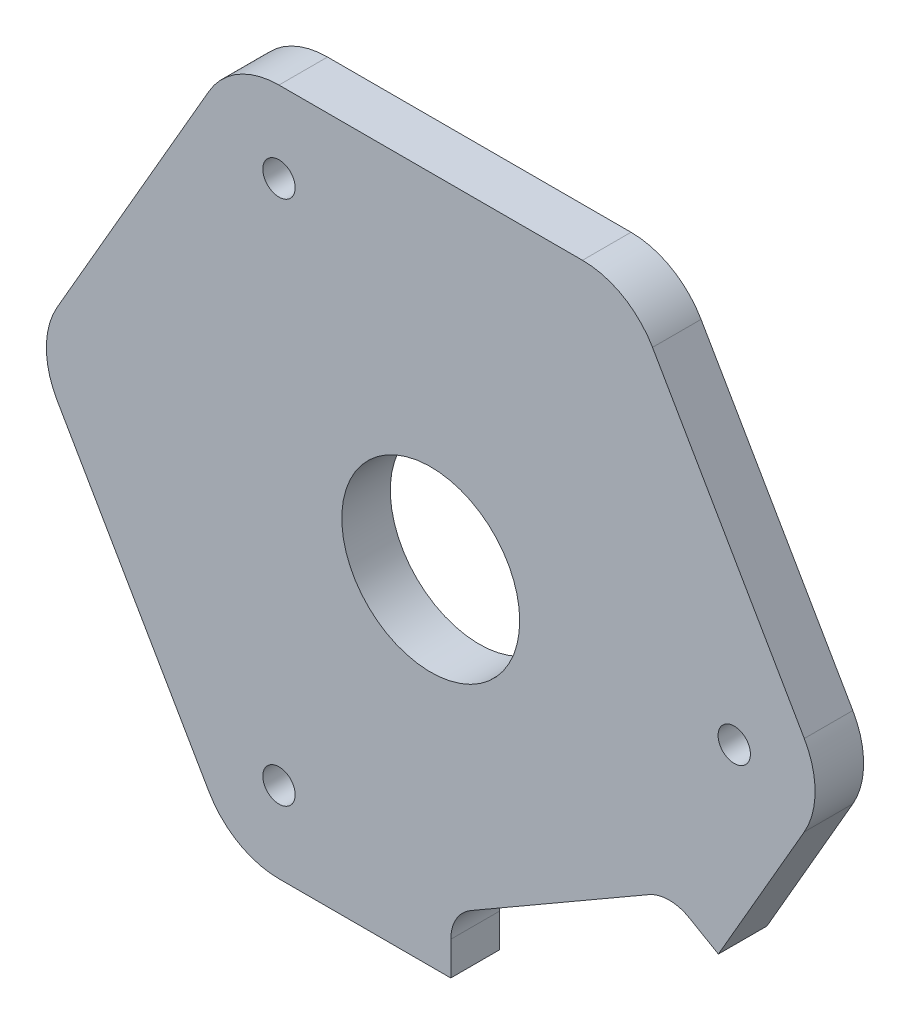
ISO-10303-21;
HEADER;
FILE_DESCRIPTION(('STEP AP214'),'2;1');
FILE_NAME('part.step','',(''),(''),'','','');
FILE_SCHEMA(('AUTOMOTIVE_DESIGN { 1 0 10303 214 1 1 1 1 }'));
ENDSEC;
DATA;
#1=APPLICATION_CONTEXT('core data for automotive mechanical design processes');
#2=APPLICATION_PROTOCOL_DEFINITION('international standard','automotive_design',2000,#1);
#3=PRODUCT_CONTEXT('',#1,'mechanical');
#4=PRODUCT('Part','Part','',(#3));
#5=PRODUCT_RELATED_PRODUCT_CATEGORY('part','',(#4));
#6=PRODUCT_DEFINITION_FORMATION('','',#4);
#7=PRODUCT_DEFINITION_CONTEXT('part definition',#1,'design');
#8=PRODUCT_DEFINITION('design','',#6,#7);
#9=PRODUCT_DEFINITION_SHAPE('','',#8);
#10=(LENGTH_UNIT() NAMED_UNIT(*) SI_UNIT(.MILLI.,.METRE.));
#11=(NAMED_UNIT(*) PLANE_ANGLE_UNIT() SI_UNIT($,.RADIAN.));
#12=(NAMED_UNIT(*) SI_UNIT($,.STERADIAN.) SOLID_ANGLE_UNIT());
#13=UNCERTAINTY_MEASURE_WITH_UNIT(LENGTH_MEASURE(1.E-05),#10,'distance_accuracy_value','');
#14=(GEOMETRIC_REPRESENTATION_CONTEXT(3) GLOBAL_UNCERTAINTY_ASSIGNED_CONTEXT((#13)) GLOBAL_UNIT_ASSIGNED_CONTEXT((#10,
#11,#12)) REPRESENTATION_CONTEXT('',''));
#15=CARTESIAN_POINT('',(0.,0.,0.));
#16=DIRECTION('',(0.,0.,1.));
#17=DIRECTION('',(1.,0.,0.));
#18=AXIS2_PLACEMENT_3D('',#15,#16,#17);
#19=CARTESIAN_POINT('',(-95.2285115252505,87.3454988234352,6.));
#20=DIRECTION('',(0.,0.,1.));
#21=DIRECTION('',(1.,0.,0.));
#22=AXIS2_PLACEMENT_3D('',#19,#20,#21);
#23=PLANE('',#22);
#24=CARTESIAN_POINT('',(-76.464627776563,119.845498823294,6.));
#25=DIRECTION('',(0.,0.,1.));
#26=DIRECTION('',(1.,0.,0.));
#27=AXIS2_PLACEMENT_3D('',#24,#25,#26);
#28=CIRCLE('',#27,11.0000000000468);
#29=CARTESIAN_POINT('',(-65.4646277765162,119.845498823294,6.));
#30=VERTEX_POINT('',#29);
#31=EDGE_CURVE('E400',#30,#30,#28,.T.);
#32=ORIENTED_EDGE('',*,*,#31,.F.);
#33=EDGE_LOOP('',(#32));
#34=FACE_BOUND('',#33,.T.);
#35=CARTESIAN_POINT('',(-38.9368602791775,119.8454988233,6.));
#36=DIRECTION('',(0.,0.,1.));
#37=DIRECTION('',(1.,0.,0.));
#38=AXIS2_PLACEMENT_3D('',#35,#36,#37);
#39=CIRCLE('',#38,1.99999999998711);
#40=CARTESIAN_POINT('',(-36.9368602791904,119.8454988233,6.));
#41=VERTEX_POINT('',#40);
#42=EDGE_CURVE('E198',#41,#41,#39,.T.);
#43=ORIENTED_EDGE('',*,*,#42,.F.);
#44=EDGE_LOOP('',(#43));
#45=FACE_BOUND('',#44,.T.);
#46=CARTESIAN_POINT('',(-95.2285115252505,87.3454988234352,6.));
#47=DIRECTION('',(0.,0.,1.));
#48=DIRECTION('',(1.,0.,0.));
#49=AXIS2_PLACEMENT_3D('',#46,#47,#48);
#50=CIRCLE('',#49,9.99999999999993);
#51=CARTESIAN_POINT('',(-103.888765563107,82.3454988234569,6.));
#52=VERTEX_POINT('',#51);
#53=CARTESIAN_POINT('',(-95.2285115252641,77.3454988234352,6.));
#54=VERTEX_POINT('',#53);
#55=EDGE_CURVE('E240',#52,#54,#50,.T.);
#56=ORIENTED_EDGE('',*,*,#55,.T.);
#57=DIRECTION('',(1.,-1.36093960537223E-12,0.));
#58=VECTOR('',#57,1.);
#59=CARTESIAN_POINT('',(-95.2285115252641,77.3454988234352,6.));
#60=LINE('',#59,#58);
#61=CARTESIAN_POINT('',(-73.9877217873748,77.3454988234063,6.));
#62=VERTEX_POINT('',#61);
#63=EDGE_CURVE('E128',#54,#62,#60,.T.);
#64=ORIENTED_EDGE('',*,*,#63,.T.);
#65=DIRECTION('',(1.40578382609998E-12,1.,0.));
#66=VECTOR('',#65,1.);
#67=CARTESIAN_POINT('',(-73.987721787369,81.4917059222975,6.));
#68=LINE('',#67,#66);
#69=CARTESIAN_POINT('',(-73.987721787369,81.4917059222975,6.));
#70=VERTEX_POINT('',#69);
#71=EDGE_CURVE('E293',#62,#70,#68,.T.);
#72=ORIENTED_EDGE('',*,*,#71,.T.);
#73=CARTESIAN_POINT('',(-68.9877217873679,81.4917059222904,6.));
#74=DIRECTION('',(0.,0.,-1.));
#75=DIRECTION('',(1.,0.,0.));
#76=AXIS2_PLACEMENT_3D('',#73,#74,#75);
#77=CIRCLE('',#76,5.00000000000106);
#78=CARTESIAN_POINT('',(-71.4877217873791,85.8218329412074,6.));
#79=VERTEX_POINT('',#78);
#80=EDGE_CURVE('E313',#70,#79,#77,.T.);
#81=ORIENTED_EDGE('',*,*,#80,.T.);
#82=DIRECTION('',(0.866025403788267,0.49999999999337,0.));
#83=VECTOR('',#82,1.);
#84=CARTESIAN_POINT('',(-49.4877217872818,98.5235388632108,6.));
#85=LINE('',#84,#83);
#86=CARTESIAN_POINT('',(-49.4877217872818,98.5235388632108,6.));
#87=VERTEX_POINT('',#86);
#88=EDGE_CURVE('E309',#79,#87,#85,.T.);
#89=ORIENTED_EDGE('',*,*,#88,.T.);
#90=CARTESIAN_POINT('',(-46.9877217872387,94.1934118443123,6.));
#91=DIRECTION('',(0.,0.,-1.));
#92=DIRECTION('',(1.,0.,0.));
#93=AXIS2_PLACEMENT_3D('',#90,#91,#92);
#94=CIRCLE('',#93,5.00000000000106);
#95=CARTESIAN_POINT('',(-44.4877217872808,98.52353886326,6.));
#96=VERTEX_POINT('',#95);
#97=EDGE_CURVE('E312',#87,#96,#94,.T.);
#98=ORIENTED_EDGE('',*,*,#97,.T.);
#99=DIRECTION('',(0.866025403785888,-0.499999999997489,0.));
#100=VECTOR('',#99,1.);
#101=CARTESIAN_POINT('',(-40.8970011102855,96.4504353138259,6.));
#102=LINE('',#101,#100);
#103=CARTESIAN_POINT('',(-40.8970011102855,96.4504353138259,6.));
#104=VERTEX_POINT('',#103);
#105=EDGE_CURVE('E317',#96,#104,#102,.T.);
#106=ORIENTED_EDGE('',*,*,#105,.T.);
#107=DIRECTION('',(0.49999999999747,0.866025403785899,0.));
#108=VECTOR('',#107,1.);
#109=CARTESIAN_POINT('',(-40.8970011102855,96.4504353138259,6.));
#110=LINE('',#109,#108);
#111=CARTESIAN_POINT('',(-30.2766062413946,114.845498823313,6.));
#112=VERTEX_POINT('',#111);
#113=EDGE_CURVE('E324',#104,#112,#110,.T.);
#114=ORIENTED_EDGE('',*,*,#113,.T.);
#115=CARTESIAN_POINT('',(-38.9368602792535,119.845498823287,6.));
#116=DIRECTION('',(0.,0.,1.));
#117=DIRECTION('',(1.,0.,0.));
#118=AXIS2_PLACEMENT_3D('',#115,#116,#117);
#119=CIRCLE('',#118,9.99999999999992);
#120=CARTESIAN_POINT('',(-30.2766062413858,124.845498823247,6.));
#121=VERTEX_POINT('',#120);
#122=EDGE_CURVE('E327',#112,#121,#119,.T.);
#123=ORIENTED_EDGE('',*,*,#122,.T.);
#124=DIRECTION('',(-0.499999999995949,0.866025403786777,0.));
#125=VECTOR('',#124,1.);
#126=CARTESIAN_POINT('',(-30.2766062413858,124.845498823247,6.));
#127=LINE('',#126,#125);
#128=CARTESIAN_POINT('',(-49.0404899898958,157.345498823333,6.));
#129=VERTEX_POINT('',#128);
#130=EDGE_CURVE('E330',#121,#129,#127,.T.);
#131=ORIENTED_EDGE('',*,*,#130,.T.);
#132=CARTESIAN_POINT('',(-57.7007440277636,152.345498823374,6.));
#133=DIRECTION('',(0.,0.,1.));
#134=DIRECTION('',(1.,0.,0.));
#135=AXIS2_PLACEMENT_3D('',#132,#133,#134);
#136=CIRCLE('',#135,9.99999999999995);
#137=CARTESIAN_POINT('',(-57.7007440277479,162.345498823374,6.));
#138=VERTEX_POINT('',#137);
#139=EDGE_CURVE('E333',#129,#138,#136,.T.);
#140=ORIENTED_EDGE('',*,*,#139,.T.);
#141=DIRECTION('',(-1.,1.5590789780372E-12,0.));
#142=VECTOR('',#141,1.);
#143=CARTESIAN_POINT('',(-57.7007440277479,162.345498823374,6.));
#144=LINE('',#143,#142);
#145=CARTESIAN_POINT('',(-95.2285115250721,162.345498823432,6.));
#146=VERTEX_POINT('',#145);
#147=EDGE_CURVE('E336',#138,#146,#144,.T.);
#148=ORIENTED_EDGE('',*,*,#147,.T.);
#149=CARTESIAN_POINT('',(-95.2285115250877,152.345498823432,6.));
#150=DIRECTION('',(0.,0.,1.));
#151=DIRECTION('',(1.,0.,0.));
#152=AXIS2_PLACEMENT_3D('',#149,#150,#151);
#153=CIRCLE('',#152,9.99999999999993);
#154=CARTESIAN_POINT('',(-103.88876556292,157.345498823454,6.));
#155=VERTEX_POINT('',#154);
#156=EDGE_CURVE('E171',#146,#155,#153,.T.);
#157=ORIENTED_EDGE('',*,*,#156,.T.);
#158=DIRECTION('',(-0.500000000002172,-0.866025403783184,0.));
#159=VECTOR('',#158,1.);
#160=CARTESIAN_POINT('',(-103.88876556292,157.345498823454,6.));
#161=LINE('',#160,#159);
#162=CARTESIAN_POINT('',(-122.652649311663,124.845498823503,6.));
#163=VERTEX_POINT('',#162);
#164=EDGE_CURVE('E165',#155,#163,#161,.T.);
#165=ORIENTED_EDGE('',*,*,#164,.T.);
#166=CARTESIAN_POINT('',(-113.992395273831,119.845498823481,6.));
#167=DIRECTION('',(0.,0.,1.));
#168=DIRECTION('',(1.,0.,0.));
#169=AXIS2_PLACEMENT_3D('',#166,#167,#168);
#170=CIRCLE('',#169,9.99999999999992);
#171=CARTESIAN_POINT('',(-122.652649311688,114.845498823503,6.));
#172=VERTEX_POINT('',#171);
#173=EDGE_CURVE('E169',#163,#172,#170,.T.);
#174=ORIENTED_EDGE('',*,*,#173,.T.);
#175=DIRECTION('',(0.499999999997828,-0.866025403785692,0.));
#176=VECTOR('',#175,1.);
#177=CARTESIAN_POINT('',(-122.652649311688,114.845498823503,6.));
#178=LINE('',#177,#176);
#179=EDGE_CURVE('E61',#172,#52,#178,.T.);
#180=ORIENTED_EDGE('',*,*,#179,.T.);
#181=EDGE_LOOP('',(#56,#64,#72,#81,#89,#98,#106,#114,#123,#131,#140,#148,#157,#165,#174,#180));
#182=FACE_BOUND('',#181,.T.);
#183=CARTESIAN_POINT('',(-95.2285115250872,152.345498823434,6.));
#184=DIRECTION('',(0.,0.,1.));
#185=DIRECTION('',(1.,0.,0.));
#186=AXIS2_PLACEMENT_3D('',#183,#184,#185);
#187=CIRCLE('',#186,1.99999999987354);
#188=CARTESIAN_POINT('',(-93.2285115252137,152.345498823434,6.));
#189=VERTEX_POINT('',#188);
#190=EDGE_CURVE('E408',#189,#189,#187,.T.);
#191=ORIENTED_EDGE('',*,*,#190,.F.);
#192=EDGE_LOOP('',(#191));
#193=FACE_BOUND('',#192,.T.);
#194=CARTESIAN_POINT('',(-95.2285115252426,87.3454988234329,6.));
#195=DIRECTION('',(0.,0.,1.));
#196=DIRECTION('',(1.,0.,0.));
#197=AXIS2_PLACEMENT_3D('',#194,#195,#196);
#198=CIRCLE('',#197,2.00000000002254);
#199=CARTESIAN_POINT('',(-93.22851152522,87.3454988234329,6.));
#200=VERTEX_POINT('',#199);
#201=EDGE_CURVE('E389',#200,#200,#198,.T.);
#202=ORIENTED_EDGE('',*,*,#201,.F.);
#203=EDGE_LOOP('',(#202));
#204=FACE_BOUND('',#203,.T.);
#205=ADVANCED_FACE('F43',(#34,#45,#182,#193,#204),#23,.T.);
#206=CARTESIAN_POINT('',(-95.2285115252505,87.3454988234352,0.));
#207=DIRECTION('',(0.,0.,1.));
#208=DIRECTION('',(1.,0.,0.));
#209=AXIS2_PLACEMENT_3D('',#206,#207,#208);
#210=PLANE('',#209);
#211=CARTESIAN_POINT('',(-95.2285115252505,87.3454988234352,0.));
#212=DIRECTION('',(0.,0.,1.));
#213=DIRECTION('',(1.,0.,0.));
#214=AXIS2_PLACEMENT_3D('',#211,#212,#213);
#215=CIRCLE('',#214,9.99999999999993);
#216=CARTESIAN_POINT('',(-103.888765563107,82.3454988234569,0.));
#217=VERTEX_POINT('',#216);
#218=CARTESIAN_POINT('',(-95.2285115252641,77.3454988234352,0.));
#219=VERTEX_POINT('',#218);
#220=EDGE_CURVE('E193',#217,#219,#215,.T.);
#221=ORIENTED_EDGE('',*,*,#220,.F.);
#222=DIRECTION('',(0.499999999997828,-0.866025403785692,0.));
#223=VECTOR('',#222,1.);
#224=CARTESIAN_POINT('',(-122.652649311688,114.845498823503,0.));
#225=LINE('',#224,#223);
#226=CARTESIAN_POINT('',(-122.652649311688,114.845498823503,0.));
#227=VERTEX_POINT('',#226);
#228=EDGE_CURVE('E120',#227,#217,#225,.T.);
#229=ORIENTED_EDGE('',*,*,#228,.F.);
#230=CARTESIAN_POINT('',(-113.992395273831,119.845498823481,0.));
#231=DIRECTION('',(0.,0.,1.));
#232=DIRECTION('',(1.,0.,0.));
#233=AXIS2_PLACEMENT_3D('',#230,#231,#232);
#234=CIRCLE('',#233,9.99999999999992);
#235=CARTESIAN_POINT('',(-122.652649311663,124.845498823503,0.));
#236=VERTEX_POINT('',#235);
#237=EDGE_CURVE('E114',#236,#227,#234,.T.);
#238=ORIENTED_EDGE('',*,*,#237,.F.);
#239=DIRECTION('',(-0.500000000002172,-0.866025403783184,0.));
#240=VECTOR('',#239,1.);
#241=CARTESIAN_POINT('',(-103.88876556292,157.345498823454,0.));
#242=LINE('',#241,#240);
#243=CARTESIAN_POINT('',(-103.88876556292,157.345498823454,0.));
#244=VERTEX_POINT('',#243);
#245=EDGE_CURVE('E180',#244,#236,#242,.T.);
#246=ORIENTED_EDGE('',*,*,#245,.F.);
#247=CARTESIAN_POINT('',(-95.2285115250877,152.345498823432,0.));
#248=DIRECTION('',(0.,0.,1.));
#249=DIRECTION('',(1.,0.,0.));
#250=AXIS2_PLACEMENT_3D('',#247,#248,#249);
#251=CIRCLE('',#250,9.99999999999993);
#252=CARTESIAN_POINT('',(-95.2285115250721,162.345498823432,0.));
#253=VERTEX_POINT('',#252);
#254=EDGE_CURVE('E231',#253,#244,#251,.T.);
#255=ORIENTED_EDGE('',*,*,#254,.F.);
#256=DIRECTION('',(-1.,1.5590789780372E-12,0.));
#257=VECTOR('',#256,1.);
#258=CARTESIAN_POINT('',(-57.7007440277479,162.345498823374,0.));
#259=LINE('',#258,#257);
#260=CARTESIAN_POINT('',(-57.7007440277479,162.345498823374,0.));
#261=VERTEX_POINT('',#260);
#262=EDGE_CURVE('E228',#261,#253,#259,.T.);
#263=ORIENTED_EDGE('',*,*,#262,.F.);
#264=CARTESIAN_POINT('',(-57.7007440277636,152.345498823374,0.));
#265=DIRECTION('',(0.,0.,1.));
#266=DIRECTION('',(1.,0.,0.));
#267=AXIS2_PLACEMENT_3D('',#264,#265,#266);
#268=CIRCLE('',#267,9.99999999999995);
#269=CARTESIAN_POINT('',(-49.0404899898958,157.345498823333,0.));
#270=VERTEX_POINT('',#269);
#271=EDGE_CURVE('E225',#270,#261,#268,.T.);
#272=ORIENTED_EDGE('',*,*,#271,.F.);
#273=DIRECTION('',(-0.499999999995949,0.866025403786777,0.));
#274=VECTOR('',#273,1.);
#275=CARTESIAN_POINT('',(-30.2766062413858,124.845498823247,0.));
#276=LINE('',#275,#274);
#277=CARTESIAN_POINT('',(-30.2766062413858,124.845498823247,0.));
#278=VERTEX_POINT('',#277);
#279=EDGE_CURVE('E222',#278,#270,#276,.T.);
#280=ORIENTED_EDGE('',*,*,#279,.F.);
#281=CARTESIAN_POINT('',(-38.9368602792535,119.845498823287,0.));
#282=DIRECTION('',(0.,0.,1.));
#283=DIRECTION('',(1.,0.,0.));
#284=AXIS2_PLACEMENT_3D('',#281,#282,#283);
#285=CIRCLE('',#284,9.99999999999992);
#286=CARTESIAN_POINT('',(-30.2766062413946,114.845498823313,0.));
#287=VERTEX_POINT('',#286);
#288=EDGE_CURVE('E219',#287,#278,#285,.T.);
#289=ORIENTED_EDGE('',*,*,#288,.F.);
#290=DIRECTION('',(0.49999999999747,0.866025403785899,0.));
#291=VECTOR('',#290,1.);
#292=CARTESIAN_POINT('',(-40.8970011102855,96.4504353138259,0.));
#293=LINE('',#292,#291);
#294=CARTESIAN_POINT('',(-40.8970011102855,96.4504353138259,0.));
#295=VERTEX_POINT('',#294);
#296=EDGE_CURVE('E216',#295,#287,#293,.T.);
#297=ORIENTED_EDGE('',*,*,#296,.F.);
#298=DIRECTION('',(0.866025403785888,-0.499999999997489,0.));
#299=VECTOR('',#298,1.);
#300=CARTESIAN_POINT('',(-40.8970011102855,96.4504353138259,0.));
#301=LINE('',#300,#299);
#302=CARTESIAN_POINT('',(-44.4877217872808,98.52353886326,0.));
#303=VERTEX_POINT('',#302);
#304=EDGE_CURVE('E213',#303,#295,#301,.T.);
#305=ORIENTED_EDGE('',*,*,#304,.F.);
#306=CARTESIAN_POINT('',(-46.9877217872387,94.1934118443123,0.));
#307=DIRECTION('',(0.,0.,-1.));
#308=DIRECTION('',(1.,0.,0.));
#309=AXIS2_PLACEMENT_3D('',#306,#307,#308);
#310=CIRCLE('',#309,5.00000000000106);
#311=CARTESIAN_POINT('',(-49.4877217872818,98.5235388632108,0.));
#312=VERTEX_POINT('',#311);
#313=EDGE_CURVE('E210',#312,#303,#310,.T.);
#314=ORIENTED_EDGE('',*,*,#313,.F.);
#315=DIRECTION('',(0.866025403788267,0.49999999999337,0.));
#316=VECTOR('',#315,1.);
#317=CARTESIAN_POINT('',(-49.4877217872818,98.5235388632108,0.));
#318=LINE('',#317,#316);
#319=CARTESIAN_POINT('',(-71.4877217873791,85.8218329412074,0.));
#320=VERTEX_POINT('',#319);
#321=EDGE_CURVE('E207',#320,#312,#318,.T.);
#322=ORIENTED_EDGE('',*,*,#321,.F.);
#323=CARTESIAN_POINT('',(-68.9877217873679,81.4917059222904,0.));
#324=DIRECTION('',(0.,0.,-1.));
#325=DIRECTION('',(1.,0.,0.));
#326=AXIS2_PLACEMENT_3D('',#323,#324,#325);
#327=CIRCLE('',#326,5.00000000000106);
#328=CARTESIAN_POINT('',(-73.987721787369,81.4917059222975,0.));
#329=VERTEX_POINT('',#328);
#330=EDGE_CURVE('E204',#329,#320,#327,.T.);
#331=ORIENTED_EDGE('',*,*,#330,.F.);
#332=DIRECTION('',(1.40578382609998E-12,1.,0.));
#333=VECTOR('',#332,1.);
#334=CARTESIAN_POINT('',(-73.987721787369,81.4917059222975,0.));
#335=LINE('',#334,#333);
#336=CARTESIAN_POINT('',(-73.9877217873748,77.3454988234063,0.));
#337=VERTEX_POINT('',#336);
#338=EDGE_CURVE('E201',#337,#329,#335,.T.);
#339=ORIENTED_EDGE('',*,*,#338,.F.);
#340=DIRECTION('',(1.,-1.36093960537223E-12,0.));
#341=VECTOR('',#340,1.);
#342=CARTESIAN_POINT('',(-95.2285115252641,77.3454988234352,0.));
#343=LINE('',#342,#341);
#344=EDGE_CURVE('E197',#219,#337,#343,.T.);
#345=ORIENTED_EDGE('',*,*,#344,.F.);
#346=EDGE_LOOP('',(#221,#229,#238,#246,#255,#263,#272,#280,#289,#297,#305,#314,#322,#331,#339,#345));
#347=FACE_BOUND('',#346,.T.);
#348=CARTESIAN_POINT('',(-38.9368602791775,119.8454988233,0.));
#349=DIRECTION('',(0.,0.,1.));
#350=DIRECTION('',(1.,0.,0.));
#351=AXIS2_PLACEMENT_3D('',#348,#349,#350);
#352=CIRCLE('',#351,1.99999999998711);
#353=CARTESIAN_POINT('',(-36.9368602791904,119.8454988233,0.));
#354=VERTEX_POINT('',#353);
#355=EDGE_CURVE('E412',#354,#354,#352,.T.);
#356=ORIENTED_EDGE('',*,*,#355,.T.);
#357=EDGE_LOOP('',(#356));
#358=FACE_BOUND('',#357,.T.);
#359=CARTESIAN_POINT('',(-95.2285115250872,152.345498823434,0.));
#360=DIRECTION('',(0.,0.,1.));
#361=DIRECTION('',(1.,0.,0.));
#362=AXIS2_PLACEMENT_3D('',#359,#360,#361);
#363=CIRCLE('',#362,1.99999999987354);
#364=CARTESIAN_POINT('',(-93.2285115252137,152.345498823434,0.));
#365=VERTEX_POINT('',#364);
#366=EDGE_CURVE('E404',#365,#365,#363,.T.);
#367=ORIENTED_EDGE('',*,*,#366,.T.);
#368=EDGE_LOOP('',(#367));
#369=FACE_BOUND('',#368,.T.);
#370=CARTESIAN_POINT('',(-76.464627776563,119.845498823294,0.));
#371=DIRECTION('',(0.,0.,1.));
#372=DIRECTION('',(1.,0.,0.));
#373=AXIS2_PLACEMENT_3D('',#370,#371,#372);
#374=CIRCLE('',#373,11.0000000000468);
#375=CARTESIAN_POINT('',(-65.4646277765162,119.845498823294,0.));
#376=VERTEX_POINT('',#375);
#377=EDGE_CURVE('E397',#376,#376,#374,.T.);
#378=ORIENTED_EDGE('',*,*,#377,.T.);
#379=EDGE_LOOP('',(#378));
#380=FACE_BOUND('',#379,.T.);
#381=CARTESIAN_POINT('',(-95.2285115252426,87.3454988234329,0.));
#382=DIRECTION('',(0.,0.,1.));
#383=DIRECTION('',(1.,0.,0.));
#384=AXIS2_PLACEMENT_3D('',#381,#382,#383);
#385=CIRCLE('',#384,2.00000000002254);
#386=CARTESIAN_POINT('',(-93.22851152522,87.3454988234329,0.));
#387=VERTEX_POINT('',#386);
#388=EDGE_CURVE('E392',#387,#387,#385,.T.);
#389=ORIENTED_EDGE('',*,*,#388,.T.);
#390=EDGE_LOOP('',(#389));
#391=FACE_BOUND('',#390,.T.);
#392=ADVANCED_FACE('F297',(#347,#358,#369,#380,#391),#210,.F.);
#393=CARTESIAN_POINT('',(-95.2285115252505,87.3454988234352,6.));
#394=DIRECTION('',(0.,0.,-1.));
#395=DIRECTION('',(-1.,0.,0.));
#396=AXIS2_PLACEMENT_3D('',#393,#394,#395);
#397=CYLINDRICAL_SURFACE('',#396,9.99999999999993);
#398=ORIENTED_EDGE('',*,*,#220,.T.);
#399=DIRECTION('',(0.,0.,-1.));
#400=VECTOR('',#399,1.);
#401=CARTESIAN_POINT('',(-95.2285115252641,77.3454988234352,6.));
#402=LINE('',#401,#400);
#403=EDGE_CURVE('E11',#54,#219,#402,.T.);
#404=ORIENTED_EDGE('',*,*,#403,.F.);
#405=ORIENTED_EDGE('',*,*,#55,.F.);
#406=DIRECTION('',(0.,0.,-1.));
#407=VECTOR('',#406,1.);
#408=CARTESIAN_POINT('',(-103.888765563107,82.3454988234569,6.));
#409=LINE('',#408,#407);
#410=EDGE_CURVE('E189',#52,#217,#409,.T.);
#411=ORIENTED_EDGE('',*,*,#410,.T.);
#412=EDGE_LOOP('',(#398,#404,#405,#411));
#413=FACE_BOUND('',#412,.T.);
#414=ADVANCED_FACE('F45',(#413),#397,.T.);
#415=CARTESIAN_POINT('',(-95.2285115252641,77.3454988234352,6.));
#416=DIRECTION('',(1.36093960537223E-12,1.,0.));
#417=DIRECTION('',(-1.,1.36093960537223E-12,0.));
#418=AXIS2_PLACEMENT_3D('',#415,#416,#417);
#419=PLANE('',#418);
#420=ORIENTED_EDGE('',*,*,#344,.T.);
#421=DIRECTION('',(0.,0.,-1.));
#422=VECTOR('',#421,1.);
#423=CARTESIAN_POINT('',(-73.9877217873748,77.3454988234063,6.));
#424=LINE('',#423,#422);
#425=EDGE_CURVE('E53',#62,#337,#424,.T.);
#426=ORIENTED_EDGE('',*,*,#425,.F.);
#427=ORIENTED_EDGE('',*,*,#63,.F.);
#428=ORIENTED_EDGE('',*,*,#403,.T.);
#429=EDGE_LOOP('',(#420,#426,#427,#428));
#430=FACE_BOUND('',#429,.T.);
#431=ADVANCED_FACE('F582',(#430),#419,.F.);
#432=CARTESIAN_POINT('',(-73.987721787369,81.4917059222975,6.));
#433=DIRECTION('',(-1.,1.40578382609998E-12,0.));
#434=DIRECTION('',(-1.40578382609998E-12,-1.,0.));
#435=AXIS2_PLACEMENT_3D('',#432,#433,#434);
#436=PLANE('',#435);
#437=ORIENTED_EDGE('',*,*,#338,.T.);
#438=DIRECTION('',(0.,0.,-1.));
#439=VECTOR('',#438,1.);
#440=CARTESIAN_POINT('',(-73.987721787369,81.4917059222975,6.));
#441=LINE('',#440,#439);
#442=EDGE_CURVE('E283',#70,#329,#441,.T.);
#443=ORIENTED_EDGE('',*,*,#442,.F.);
#444=ORIENTED_EDGE('',*,*,#71,.F.);
#445=ORIENTED_EDGE('',*,*,#425,.T.);
#446=EDGE_LOOP('',(#437,#443,#444,#445));
#447=FACE_BOUND('',#446,.T.);
#448=ADVANCED_FACE('F291',(#447),#436,.F.);
#449=CARTESIAN_POINT('',(-68.9877217873679,81.4917059222904,6.));
#450=DIRECTION('',(0.,0.,-1.));
#451=DIRECTION('',(-1.,0.,0.));
#452=AXIS2_PLACEMENT_3D('',#449,#450,#451);
#453=CYLINDRICAL_SURFACE('',#452,5.00000000000106);
#454=ORIENTED_EDGE('',*,*,#330,.T.);
#455=DIRECTION('',(0.,0.,-1.));
#456=VECTOR('',#455,1.);
#457=CARTESIAN_POINT('',(-71.4877217873791,85.8218329412074,6.));
#458=LINE('',#457,#456);
#459=EDGE_CURVE('E279',#79,#320,#458,.T.);
#460=ORIENTED_EDGE('',*,*,#459,.F.);
#461=ORIENTED_EDGE('',*,*,#80,.F.);
#462=ORIENTED_EDGE('',*,*,#442,.T.);
#463=EDGE_LOOP('',(#454,#460,#461,#462));
#464=FACE_BOUND('',#463,.T.);
#465=ADVANCED_FACE('F303',(#464),#453,.F.);
#466=CARTESIAN_POINT('',(-49.4877217872818,98.5235388632108,6.));
#467=DIRECTION('',(-0.49999999999337,0.866025403788266,0.));
#468=DIRECTION('',(-0.866025403788266,-0.49999999999337,0.));
#469=AXIS2_PLACEMENT_3D('',#466,#467,#468);
#470=PLANE('',#469);
#471=ORIENTED_EDGE('',*,*,#321,.T.);
#472=DIRECTION('',(0.,0.,-1.));
#473=VECTOR('',#472,1.);
#474=CARTESIAN_POINT('',(-49.4877217872818,98.5235388632108,6.));
#475=LINE('',#474,#473);
#476=EDGE_CURVE('E275',#87,#312,#475,.T.);
#477=ORIENTED_EDGE('',*,*,#476,.F.);
#478=ORIENTED_EDGE('',*,*,#88,.F.);
#479=ORIENTED_EDGE('',*,*,#459,.T.);
#480=EDGE_LOOP('',(#471,#477,#478,#479));
#481=FACE_BOUND('',#480,.T.);
#482=ADVANCED_FACE('F307',(#481),#470,.F.);
#483=CARTESIAN_POINT('',(-46.9877217872387,94.1934118443123,6.));
#484=DIRECTION('',(0.,0.,-1.));
#485=DIRECTION('',(-1.,0.,0.));
#486=AXIS2_PLACEMENT_3D('',#483,#484,#485);
#487=CYLINDRICAL_SURFACE('',#486,5.00000000000106);
#488=ORIENTED_EDGE('',*,*,#313,.T.);
#489=DIRECTION('',(0.,0.,-1.));
#490=VECTOR('',#489,1.);
#491=CARTESIAN_POINT('',(-44.4877217872808,98.52353886326,6.));
#492=LINE('',#491,#490);
#493=EDGE_CURVE('E271',#96,#303,#492,.T.);
#494=ORIENTED_EDGE('',*,*,#493,.F.);
#495=ORIENTED_EDGE('',*,*,#97,.F.);
#496=ORIENTED_EDGE('',*,*,#476,.T.);
#497=EDGE_LOOP('',(#488,#494,#495,#496));
#498=FACE_BOUND('',#497,.T.);
#499=ADVANCED_FACE('F543',(#498),#487,.F.);
#500=CARTESIAN_POINT('',(-40.8970011102855,96.4504353138259,6.));
#501=DIRECTION('',(0.499999999997489,0.866025403785889,0.));
#502=DIRECTION('',(-0.866025403785889,0.499999999997489,0.));
#503=AXIS2_PLACEMENT_3D('',#500,#501,#502);
#504=PLANE('',#503);
#505=ORIENTED_EDGE('',*,*,#304,.T.);
#506=DIRECTION('',(0.,0.,-1.));
#507=VECTOR('',#506,1.);
#508=CARTESIAN_POINT('',(-40.8970011102855,96.4504353138259,6.));
#509=LINE('',#508,#507);
#510=EDGE_CURVE('E267',#104,#295,#509,.T.);
#511=ORIENTED_EDGE('',*,*,#510,.F.);
#512=ORIENTED_EDGE('',*,*,#105,.F.);
#513=ORIENTED_EDGE('',*,*,#493,.T.);
#514=EDGE_LOOP('',(#505,#511,#512,#513));
#515=FACE_BOUND('',#514,.T.);
#516=ADVANCED_FACE('F532',(#515),#504,.F.);
#517=CARTESIAN_POINT('',(-40.8970011102855,96.4504353138259,6.));
#518=DIRECTION('',(-0.866025403785899,0.49999999999747,0.));
#519=DIRECTION('',(-0.49999999999747,-0.8660254037859,0.));
#520=AXIS2_PLACEMENT_3D('',#517,#518,#519);
#521=PLANE('',#520);
#522=ORIENTED_EDGE('',*,*,#296,.T.);
#523=DIRECTION('',(0.,0.,-1.));
#524=VECTOR('',#523,1.);
#525=CARTESIAN_POINT('',(-30.2766062413946,114.845498823313,6.));
#526=LINE('',#525,#524);
#527=EDGE_CURVE('E263',#112,#287,#526,.T.);
#528=ORIENTED_EDGE('',*,*,#527,.F.);
#529=ORIENTED_EDGE('',*,*,#113,.F.);
#530=ORIENTED_EDGE('',*,*,#510,.T.);
#531=EDGE_LOOP('',(#522,#528,#529,#530));
#532=FACE_BOUND('',#531,.T.);
#533=ADVANCED_FACE('F521',(#532),#521,.F.);
#534=CARTESIAN_POINT('',(-38.9368602792535,119.845498823287,6.));
#535=DIRECTION('',(0.,0.,-1.));
#536=DIRECTION('',(-1.,0.,0.));
#537=AXIS2_PLACEMENT_3D('',#534,#535,#536);
#538=CYLINDRICAL_SURFACE('',#537,9.99999999999992);
#539=ORIENTED_EDGE('',*,*,#288,.T.);
#540=DIRECTION('',(0.,0.,-1.));
#541=VECTOR('',#540,1.);
#542=CARTESIAN_POINT('',(-30.2766062413858,124.845498823247,6.));
#543=LINE('',#542,#541);
#544=EDGE_CURVE('E259',#121,#278,#543,.T.);
#545=ORIENTED_EDGE('',*,*,#544,.F.);
#546=ORIENTED_EDGE('',*,*,#122,.F.);
#547=ORIENTED_EDGE('',*,*,#527,.T.);
#548=EDGE_LOOP('',(#539,#545,#546,#547));
#549=FACE_BOUND('',#548,.T.);
#550=ADVANCED_FACE('F510',(#549),#538,.T.);
#551=CARTESIAN_POINT('',(-30.2766062413858,124.845498823247,6.));
#552=DIRECTION('',(-0.866025403786777,-0.499999999995949,0.));
#553=DIRECTION('',(0.499999999995949,-0.866025403786777,0.));
#554=AXIS2_PLACEMENT_3D('',#551,#552,#553);
#555=PLANE('',#554);
#556=ORIENTED_EDGE('',*,*,#279,.T.);
#557=DIRECTION('',(0.,0.,-1.));
#558=VECTOR('',#557,1.);
#559=CARTESIAN_POINT('',(-49.0404899898958,157.345498823333,6.));
#560=LINE('',#559,#558);
#561=EDGE_CURVE('E255',#129,#270,#560,.T.);
#562=ORIENTED_EDGE('',*,*,#561,.F.);
#563=ORIENTED_EDGE('',*,*,#130,.F.);
#564=ORIENTED_EDGE('',*,*,#544,.T.);
#565=EDGE_LOOP('',(#556,#562,#563,#564));
#566=FACE_BOUND('',#565,.T.);
#567=ADVANCED_FACE('F499',(#566),#555,.F.);
#568=CARTESIAN_POINT('',(-57.7007440277636,152.345498823374,6.));
#569=DIRECTION('',(0.,0.,-1.));
#570=DIRECTION('',(-1.,0.,0.));
#571=AXIS2_PLACEMENT_3D('',#568,#569,#570);
#572=CYLINDRICAL_SURFACE('',#571,9.99999999999995);
#573=ORIENTED_EDGE('',*,*,#271,.T.);
#574=DIRECTION('',(0.,0.,-1.));
#575=VECTOR('',#574,1.);
#576=CARTESIAN_POINT('',(-57.7007440277479,162.345498823374,6.));
#577=LINE('',#576,#575);
#578=EDGE_CURVE('E251',#138,#261,#577,.T.);
#579=ORIENTED_EDGE('',*,*,#578,.F.);
#580=ORIENTED_EDGE('',*,*,#139,.F.);
#581=ORIENTED_EDGE('',*,*,#561,.T.);
#582=EDGE_LOOP('',(#573,#579,#580,#581));
#583=FACE_BOUND('',#582,.T.);
#584=ADVANCED_FACE('F489',(#583),#572,.T.);
#585=CARTESIAN_POINT('',(-57.7007440277479,162.345498823374,6.));
#586=DIRECTION('',(-1.5590789780372E-12,-1.,0.));
#587=DIRECTION('',(1.,-1.5590789780372E-12,0.));
#588=AXIS2_PLACEMENT_3D('',#585,#586,#587);
#589=PLANE('',#588);
#590=ORIENTED_EDGE('',*,*,#262,.T.);
#591=DIRECTION('',(0.,0.,-1.));
#592=VECTOR('',#591,1.);
#593=CARTESIAN_POINT('',(-95.2285115250721,162.345498823432,6.));
#594=LINE('',#593,#592);
#595=EDGE_CURVE('E247',#146,#253,#594,.T.);
#596=ORIENTED_EDGE('',*,*,#595,.F.);
#597=ORIENTED_EDGE('',*,*,#147,.F.);
#598=ORIENTED_EDGE('',*,*,#578,.T.);
#599=EDGE_LOOP('',(#590,#596,#597,#598));
#600=FACE_BOUND('',#599,.T.);
#601=ADVANCED_FACE('F344',(#600),#589,.F.);
#602=CARTESIAN_POINT('',(-95.2285115250877,152.345498823432,6.));
#603=DIRECTION('',(0.,0.,-1.));
#604=DIRECTION('',(-1.,0.,0.));
#605=AXIS2_PLACEMENT_3D('',#602,#603,#604);
#606=CYLINDRICAL_SURFACE('',#605,9.99999999999993);
#607=ORIENTED_EDGE('',*,*,#254,.T.);
#608=DIRECTION('',(0.,0.,-1.));
#609=VECTOR('',#608,1.);
#610=CARTESIAN_POINT('',(-103.88876556292,157.345498823454,6.));
#611=LINE('',#610,#609);
#612=EDGE_CURVE('E182',#155,#244,#611,.T.);
#613=ORIENTED_EDGE('',*,*,#612,.F.);
#614=ORIENTED_EDGE('',*,*,#156,.F.);
#615=ORIENTED_EDGE('',*,*,#595,.T.);
#616=EDGE_LOOP('',(#607,#613,#614,#615));
#617=FACE_BOUND('',#616,.T.);
#618=ADVANCED_FACE('F348',(#617),#606,.T.);
#619=CARTESIAN_POINT('',(-103.88876556292,157.345498823454,6.));
#620=DIRECTION('',(0.866025403783184,-0.500000000002172,0.));
#621=DIRECTION('',(0.500000000002172,0.866025403783185,0.));
#622=AXIS2_PLACEMENT_3D('',#619,#620,#621);
#623=PLANE('',#622);
#624=ORIENTED_EDGE('',*,*,#245,.T.);
#625=DIRECTION('',(0.,0.,-1.));
#626=VECTOR('',#625,1.);
#627=CARTESIAN_POINT('',(-122.652649311663,124.845498823503,6.));
#628=LINE('',#627,#626);
#629=EDGE_CURVE('E177',#163,#236,#628,.T.);
#630=ORIENTED_EDGE('',*,*,#629,.F.);
#631=ORIENTED_EDGE('',*,*,#164,.F.);
#632=ORIENTED_EDGE('',*,*,#612,.T.);
#633=EDGE_LOOP('',(#624,#630,#631,#632));
#634=FACE_BOUND('',#633,.T.);
#635=ADVANCED_FACE('F178',(#634),#623,.F.);
#636=CARTESIAN_POINT('',(-113.992395273831,119.845498823481,6.));
#637=DIRECTION('',(0.,0.,-1.));
#638=DIRECTION('',(-1.,0.,0.));
#639=AXIS2_PLACEMENT_3D('',#636,#637,#638);
#640=CYLINDRICAL_SURFACE('',#639,9.99999999999992);
#641=ORIENTED_EDGE('',*,*,#237,.T.);
#642=DIRECTION('',(0.,0.,-1.));
#643=VECTOR('',#642,1.);
#644=CARTESIAN_POINT('',(-122.652649311688,114.845498823503,6.));
#645=LINE('',#644,#643);
#646=EDGE_CURVE('E183',#172,#227,#645,.T.);
#647=ORIENTED_EDGE('',*,*,#646,.F.);
#648=ORIENTED_EDGE('',*,*,#173,.F.);
#649=ORIENTED_EDGE('',*,*,#629,.T.);
#650=EDGE_LOOP('',(#641,#647,#648,#649));
#651=FACE_BOUND('',#650,.T.);
#652=ADVANCED_FACE('F185',(#651),#640,.T.);
#653=CARTESIAN_POINT('',(-122.652649311688,114.845498823503,6.));
#654=DIRECTION('',(0.866025403785692,0.499999999997828,0.));
#655=DIRECTION('',(-0.499999999997828,0.866025403785692,0.));
#656=AXIS2_PLACEMENT_3D('',#653,#654,#655);
#657=PLANE('',#656);
#658=ORIENTED_EDGE('',*,*,#228,.T.);
#659=ORIENTED_EDGE('',*,*,#410,.F.);
#660=ORIENTED_EDGE('',*,*,#179,.F.);
#661=ORIENTED_EDGE('',*,*,#646,.T.);
#662=EDGE_LOOP('',(#658,#659,#660,#661));
#663=FACE_BOUND('',#662,.T.);
#664=ADVANCED_FACE('F352',(#663),#657,.F.);
#665=CARTESIAN_POINT('',(-38.9368602791775,119.8454988233,6.));
#666=DIRECTION('',(0.,0.,-1.));
#667=DIRECTION('',(-1.,0.,0.));
#668=AXIS2_PLACEMENT_3D('',#665,#666,#667);
#669=CYLINDRICAL_SURFACE('',#668,1.99999999998711);
#670=ORIENTED_EDGE('',*,*,#42,.T.);
#671=EDGE_LOOP('',(#670));
#672=FACE_BOUND('',#671,.T.);
#673=ORIENTED_EDGE('',*,*,#355,.F.);
#674=EDGE_LOOP('',(#673));
#675=FACE_BOUND('',#674,.T.);
#676=ADVANCED_FACE('F354',(#672,#675),#669,.F.);
#677=CARTESIAN_POINT('',(-95.2285115250872,152.345498823434,6.));
#678=DIRECTION('',(0.,0.,-1.));
#679=DIRECTION('',(-1.,0.,0.));
#680=AXIS2_PLACEMENT_3D('',#677,#678,#679);
#681=CYLINDRICAL_SURFACE('',#680,1.99999999987354);
#682=ORIENTED_EDGE('',*,*,#190,.T.);
#683=EDGE_LOOP('',(#682));
#684=FACE_BOUND('',#683,.T.);
#685=ORIENTED_EDGE('',*,*,#366,.F.);
#686=EDGE_LOOP('',(#685));
#687=FACE_BOUND('',#686,.T.);
#688=ADVANCED_FACE('F360',(#684,#687),#681,.F.);
#689=CARTESIAN_POINT('',(-76.464627776563,119.845498823294,6.));
#690=DIRECTION('',(0.,0.,-1.));
#691=DIRECTION('',(-1.,0.,0.));
#692=AXIS2_PLACEMENT_3D('',#689,#690,#691);
#693=CYLINDRICAL_SURFACE('',#692,11.0000000000468);
#694=ORIENTED_EDGE('',*,*,#31,.T.);
#695=EDGE_LOOP('',(#694));
#696=FACE_BOUND('',#695,.T.);
#697=ORIENTED_EDGE('',*,*,#377,.F.);
#698=EDGE_LOOP('',(#697));
#699=FACE_BOUND('',#698,.T.);
#700=ADVANCED_FACE('F376',(#696,#699),#693,.F.);
#701=CARTESIAN_POINT('',(-95.2285115252426,87.3454988234329,6.));
#702=DIRECTION('',(0.,0.,-1.));
#703=DIRECTION('',(-1.,0.,0.));
#704=AXIS2_PLACEMENT_3D('',#701,#702,#703);
#705=CYLINDRICAL_SURFACE('',#704,2.00000000002254);
#706=ORIENTED_EDGE('',*,*,#201,.T.);
#707=EDGE_LOOP('',(#706));
#708=FACE_BOUND('',#707,.T.);
#709=ORIENTED_EDGE('',*,*,#388,.F.);
#710=EDGE_LOOP('',(#709));
#711=FACE_BOUND('',#710,.T.);
#712=ADVANCED_FACE('F380',(#708,#711),#705,.F.);
#713=CLOSED_SHELL('',(#205,#392,#414,#431,#448,#465,#482,#499,#516,#533,#550,#567,#584,#601,
#618,#635,#652,#664,#676,#688,#700,#712));
#714=MANIFOLD_SOLID_BREP('B2',#713);
#715=ADVANCED_BREP_SHAPE_REPRESENTATION('',(#18,#714),#14);
#716=SHAPE_DEFINITION_REPRESENTATION(#9,#715);
ENDSEC;
END-ISO-10303-21;
